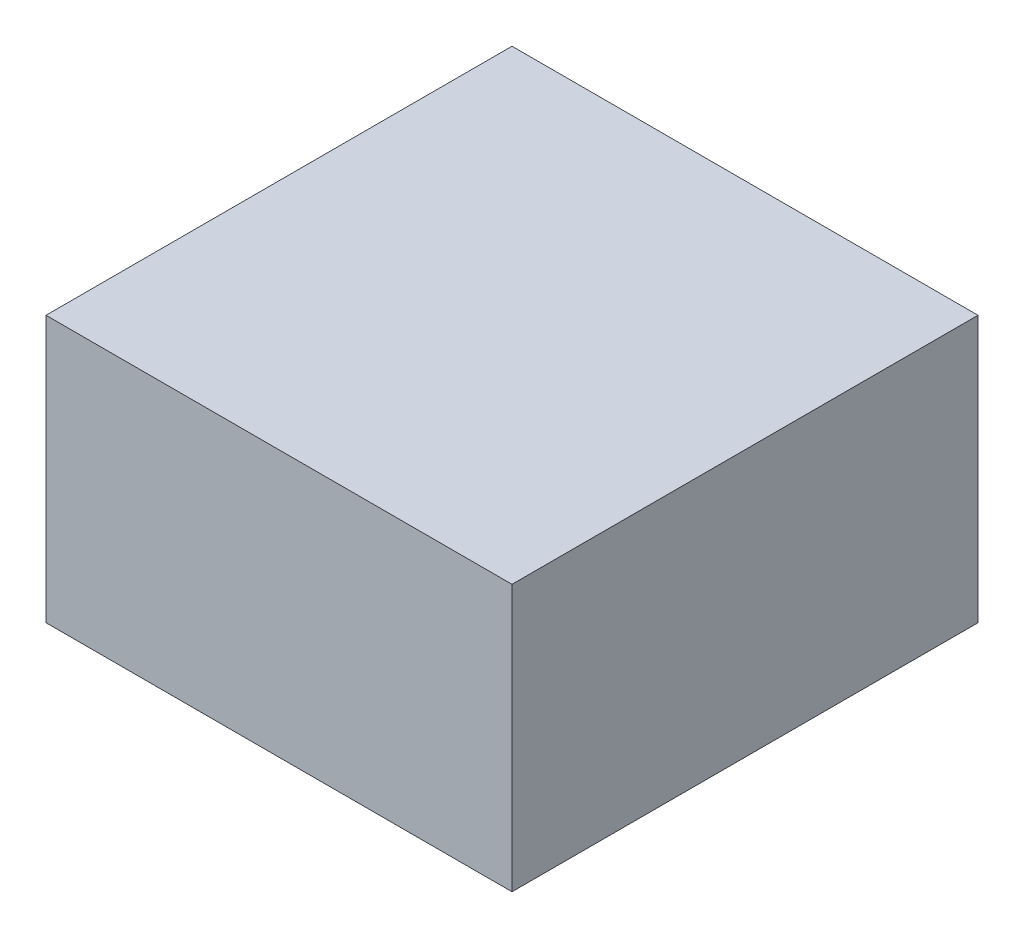
ISO-10303-21;
HEADER;
FILE_DESCRIPTION(('STEP AP214'),'2;1');
FILE_NAME('part.step','',(''),(''),'','','');
FILE_SCHEMA(('AUTOMOTIVE_DESIGN { 1 0 10303 214 1 1 1 1 }'));
ENDSEC;
DATA;
#1=APPLICATION_CONTEXT('core data for automotive mechanical design processes');
#2=APPLICATION_PROTOCOL_DEFINITION('international standard','automotive_design',2000,#1);
#3=PRODUCT_CONTEXT('',#1,'mechanical');
#4=PRODUCT('Part','Part','',(#3));
#5=PRODUCT_RELATED_PRODUCT_CATEGORY('part','',(#4));
#6=PRODUCT_DEFINITION_FORMATION('','',#4);
#7=PRODUCT_DEFINITION_CONTEXT('part definition',#1,'design');
#8=PRODUCT_DEFINITION('design','',#6,#7);
#9=PRODUCT_DEFINITION_SHAPE('','',#8);
#10=(LENGTH_UNIT() NAMED_UNIT(*) SI_UNIT(.MILLI.,.METRE.));
#11=(NAMED_UNIT(*) PLANE_ANGLE_UNIT() SI_UNIT($,.RADIAN.));
#12=(NAMED_UNIT(*) SI_UNIT($,.STERADIAN.) SOLID_ANGLE_UNIT());
#13=UNCERTAINTY_MEASURE_WITH_UNIT(LENGTH_MEASURE(1.E-05),#10,'distance_accuracy_value','');
#14=(GEOMETRIC_REPRESENTATION_CONTEXT(3) GLOBAL_UNCERTAINTY_ASSIGNED_CONTEXT((#13)) GLOBAL_UNIT_ASSIGNED_CONTEXT((#10,
#11,#12)) REPRESENTATION_CONTEXT('',''));
#15=CARTESIAN_POINT('',(0.,0.,0.));
#16=DIRECTION('',(0.,0.,1.));
#17=DIRECTION('',(1.,0.,0.));
#18=AXIS2_PLACEMENT_3D('',#15,#16,#17);
#19=CARTESIAN_POINT('',(88.9,101.6,-88.9));
#20=DIRECTION('',(-1.,0.,0.));
#21=DIRECTION('',(0.,0.,1.));
#22=AXIS2_PLACEMENT_3D('',#19,#20,#21);
#23=PLANE('',#22);
#24=DIRECTION('',(0.,0.,-1.));
#25=VECTOR('',#24,1.);
#26=CARTESIAN_POINT('',(88.9,0.,-88.9));
#27=LINE('',#26,#25);
#28=CARTESIAN_POINT('',(88.9,0.,88.9));
#29=VERTEX_POINT('',#28);
#30=CARTESIAN_POINT('',(88.9,0.,-88.9));
#31=VERTEX_POINT('',#30);
#32=EDGE_CURVE('E97',#29,#31,#27,.T.);
#33=ORIENTED_EDGE('',*,*,#32,.T.);
#34=DIRECTION('',(0.,-1.,0.));
#35=VECTOR('',#34,1.);
#36=CARTESIAN_POINT('',(88.9,101.6,-88.9));
#37=LINE('',#36,#35);
#38=CARTESIAN_POINT('',(88.9,101.6,-88.9));
#39=VERTEX_POINT('',#38);
#40=EDGE_CURVE('E11',#39,#31,#37,.T.);
#41=ORIENTED_EDGE('',*,*,#40,.F.);
#42=DIRECTION('',(0.,0.,-1.));
#43=VECTOR('',#42,1.);
#44=CARTESIAN_POINT('',(88.9,101.6,-88.9));
#45=LINE('',#44,#43);
#46=CARTESIAN_POINT('',(88.9,101.6,88.9));
#47=VERTEX_POINT('',#46);
#48=EDGE_CURVE('E85',#47,#39,#45,.T.);
#49=ORIENTED_EDGE('',*,*,#48,.F.);
#50=DIRECTION('',(0.,-1.,0.));
#51=VECTOR('',#50,1.);
#52=CARTESIAN_POINT('',(88.9,101.6,88.9));
#53=LINE('',#52,#51);
#54=EDGE_CURVE('E93',#47,#29,#53,.T.);
#55=ORIENTED_EDGE('',*,*,#54,.T.);
#56=EDGE_LOOP('',(#33,#41,#49,#55));
#57=FACE_BOUND('',#56,.T.);
#58=ADVANCED_FACE('F34',(#57),#23,.F.);
#59=CARTESIAN_POINT('',(-88.9,101.6,-88.9));
#60=DIRECTION('',(0.,0.,1.));
#61=DIRECTION('',(1.,0.,0.));
#62=AXIS2_PLACEMENT_3D('',#59,#60,#61);
#63=PLANE('',#62);
#64=DIRECTION('',(-1.,0.,0.));
#65=VECTOR('',#64,1.);
#66=CARTESIAN_POINT('',(-88.9,0.,-88.9));
#67=LINE('',#66,#65);
#68=CARTESIAN_POINT('',(-88.9,0.,-88.9));
#69=VERTEX_POINT('',#68);
#70=EDGE_CURVE('E89',#31,#69,#67,.T.);
#71=ORIENTED_EDGE('',*,*,#70,.T.);
#72=DIRECTION('',(0.,-1.,0.));
#73=VECTOR('',#72,1.);
#74=CARTESIAN_POINT('',(-88.9,101.6,-88.9));
#75=LINE('',#74,#73);
#76=CARTESIAN_POINT('',(-88.9,101.6,-88.9));
#77=VERTEX_POINT('',#76);
#78=EDGE_CURVE('E42',#77,#69,#75,.T.);
#79=ORIENTED_EDGE('',*,*,#78,.F.);
#80=DIRECTION('',(-1.,0.,0.));
#81=VECTOR('',#80,1.);
#82=CARTESIAN_POINT('',(-88.9,101.6,-88.9));
#83=LINE('',#82,#81);
#84=EDGE_CURVE('E80',#39,#77,#83,.T.);
#85=ORIENTED_EDGE('',*,*,#84,.F.);
#86=ORIENTED_EDGE('',*,*,#40,.T.);
#87=EDGE_LOOP('',(#71,#79,#85,#86));
#88=FACE_BOUND('',#87,.T.);
#89=ADVANCED_FACE('F88',(#88),#63,.F.);
#90=CARTESIAN_POINT('',(-88.9,101.6,-88.9));
#91=DIRECTION('',(1.,0.,0.));
#92=DIRECTION('',(0.,0.,-1.));
#93=AXIS2_PLACEMENT_3D('',#90,#91,#92);
#94=PLANE('',#93);
#95=DIRECTION('',(0.,0.,1.));
#96=VECTOR('',#95,1.);
#97=CARTESIAN_POINT('',(-88.9,0.,-88.9));
#98=LINE('',#97,#96);
#99=CARTESIAN_POINT('',(-88.9,0.,88.9));
#100=VERTEX_POINT('',#99);
#101=EDGE_CURVE('E67',#69,#100,#98,.T.);
#102=ORIENTED_EDGE('',*,*,#101,.T.);
#103=DIRECTION('',(0.,-1.,0.));
#104=VECTOR('',#103,1.);
#105=CARTESIAN_POINT('',(-88.9,101.6,88.9));
#106=LINE('',#105,#104);
#107=CARTESIAN_POINT('',(-88.9,101.6,88.9));
#108=VERTEX_POINT('',#107);
#109=EDGE_CURVE('E90',#108,#100,#106,.T.);
#110=ORIENTED_EDGE('',*,*,#109,.F.);
#111=DIRECTION('',(0.,0.,1.));
#112=VECTOR('',#111,1.);
#113=CARTESIAN_POINT('',(-88.9,101.6,-88.9));
#114=LINE('',#113,#112);
#115=EDGE_CURVE('E83',#77,#108,#114,.T.);
#116=ORIENTED_EDGE('',*,*,#115,.F.);
#117=ORIENTED_EDGE('',*,*,#78,.T.);
#118=EDGE_LOOP('',(#102,#110,#116,#117));
#119=FACE_BOUND('',#118,.T.);
#120=ADVANCED_FACE('F91',(#119),#94,.F.);
#121=CARTESIAN_POINT('',(-88.9,101.6,88.9));
#122=DIRECTION('',(0.,0.,-1.));
#123=DIRECTION('',(-1.,0.,0.));
#124=AXIS2_PLACEMENT_3D('',#121,#122,#123);
#125=PLANE('',#124);
#126=DIRECTION('',(1.,0.,0.));
#127=VECTOR('',#126,1.);
#128=CARTESIAN_POINT('',(-88.9,0.,88.9));
#129=LINE('',#128,#127);
#130=EDGE_CURVE('E73',#100,#29,#129,.T.);
#131=ORIENTED_EDGE('',*,*,#130,.T.);
#132=ORIENTED_EDGE('',*,*,#54,.F.);
#133=DIRECTION('',(1.,0.,0.));
#134=VECTOR('',#133,1.);
#135=CARTESIAN_POINT('',(-88.9,101.6,88.9));
#136=LINE('',#135,#134);
#137=EDGE_CURVE('E50',#108,#47,#136,.T.);
#138=ORIENTED_EDGE('',*,*,#137,.F.);
#139=ORIENTED_EDGE('',*,*,#109,.T.);
#140=EDGE_LOOP('',(#131,#132,#138,#139));
#141=FACE_BOUND('',#140,.T.);
#142=ADVANCED_FACE('F104',(#141),#125,.F.);
#143=CARTESIAN_POINT('',(0.,101.6,0.));
#144=DIRECTION('',(0.,1.,0.));
#145=DIRECTION('',(0.,0.,1.));
#146=AXIS2_PLACEMENT_3D('',#143,#144,#145);
#147=PLANE('',#146);
#148=ORIENTED_EDGE('',*,*,#48,.T.);
#149=ORIENTED_EDGE('',*,*,#84,.T.);
#150=ORIENTED_EDGE('',*,*,#115,.T.);
#151=ORIENTED_EDGE('',*,*,#137,.T.);
#152=EDGE_LOOP('',(#148,#149,#150,#151));
#153=FACE_BOUND('',#152,.T.);
#154=ADVANCED_FACE('F81',(#153),#147,.T.);
#155=CARTESIAN_POINT('',(0.,0.,0.));
#156=DIRECTION('',(0.,1.,0.));
#157=DIRECTION('',(0.,0.,1.));
#158=AXIS2_PLACEMENT_3D('',#155,#156,#157);
#159=PLANE('',#158);
#160=ORIENTED_EDGE('',*,*,#32,.F.);
#161=ORIENTED_EDGE('',*,*,#130,.F.);
#162=ORIENTED_EDGE('',*,*,#101,.F.);
#163=ORIENTED_EDGE('',*,*,#70,.F.);
#164=EDGE_LOOP('',(#160,#161,#162,#163));
#165=FACE_BOUND('',#164,.T.);
#166=ADVANCED_FACE('F107',(#165),#159,.F.);
#167=CLOSED_SHELL('',(#58,#89,#120,#142,#154,#166));
#168=MANIFOLD_SOLID_BREP('B2',#167);
#169=ADVANCED_BREP_SHAPE_REPRESENTATION('',(#18,#168),#14);
#170=SHAPE_DEFINITION_REPRESENTATION(#9,#169);
ENDSEC;
END-ISO-10303-21;
